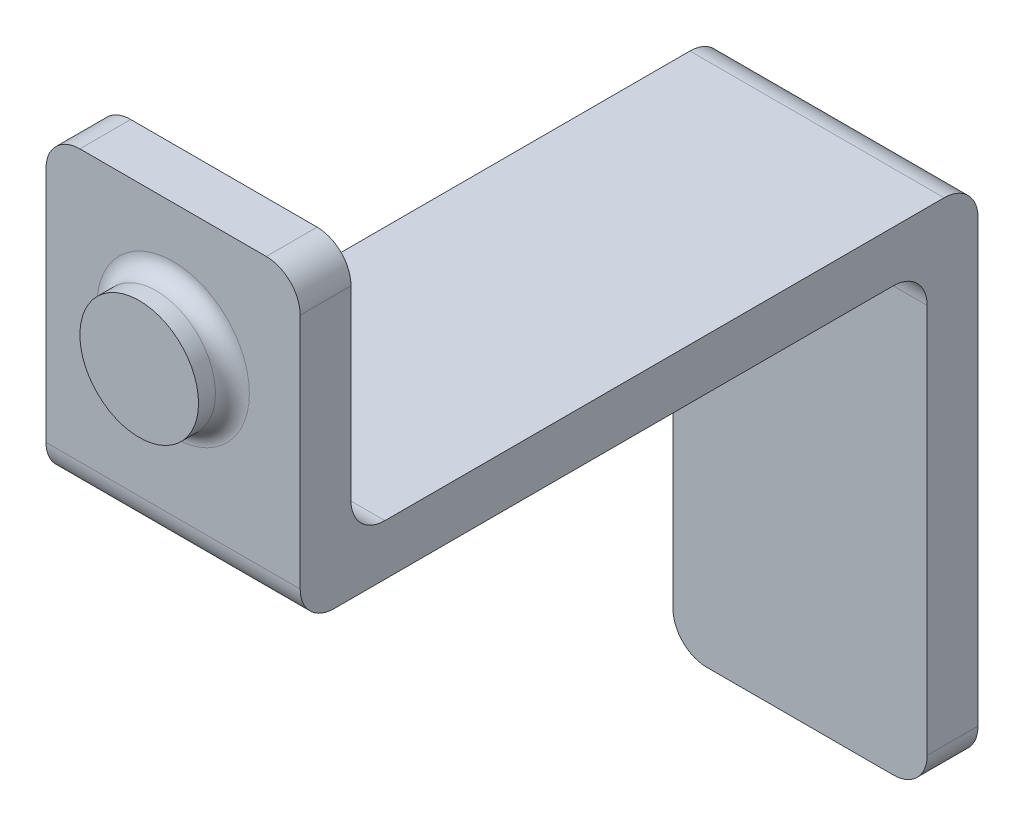
ISO-10303-21;
HEADER;
FILE_DESCRIPTION(('STEP AP214'),'2;1');
FILE_NAME('part.step','',(''),(''),'','','');
FILE_SCHEMA(('AUTOMOTIVE_DESIGN { 1 0 10303 214 1 1 1 1 }'));
ENDSEC;
DATA;
#1=APPLICATION_CONTEXT('core data for automotive mechanical design processes');
#2=APPLICATION_PROTOCOL_DEFINITION('international standard','automotive_design',2000,#1);
#3=PRODUCT_CONTEXT('',#1,'mechanical');
#4=PRODUCT('Part','Part','',(#3));
#5=PRODUCT_RELATED_PRODUCT_CATEGORY('part','',(#4));
#6=PRODUCT_DEFINITION_FORMATION('','',#4);
#7=PRODUCT_DEFINITION_CONTEXT('part definition',#1,'design');
#8=PRODUCT_DEFINITION('design','',#6,#7);
#9=PRODUCT_DEFINITION_SHAPE('','',#8);
#10=(LENGTH_UNIT() NAMED_UNIT(*) SI_UNIT(.MILLI.,.METRE.));
#11=(NAMED_UNIT(*) PLANE_ANGLE_UNIT() SI_UNIT($,.RADIAN.));
#12=(NAMED_UNIT(*) SI_UNIT($,.STERADIAN.) SOLID_ANGLE_UNIT());
#13=UNCERTAINTY_MEASURE_WITH_UNIT(LENGTH_MEASURE(1.E-05),#10,'distance_accuracy_value','');
#14=(GEOMETRIC_REPRESENTATION_CONTEXT(3) GLOBAL_UNCERTAINTY_ASSIGNED_CONTEXT((#13)) GLOBAL_UNIT_ASSIGNED_CONTEXT((#10,
#11,#12)) REPRESENTATION_CONTEXT('',''));
#15=CARTESIAN_POINT('',(0.,0.,0.));
#16=DIRECTION('',(0.,0.,1.));
#17=DIRECTION('',(1.,0.,0.));
#18=AXIS2_PLACEMENT_3D('',#15,#16,#17);
#19=CARTESIAN_POINT('',(-7.5,18.,37.));
#20=DIRECTION('',(0.,1.,0.));
#21=DIRECTION('',(0.,0.,1.));
#22=AXIS2_PLACEMENT_3D('',#19,#20,#21);
#23=PLANE('',#22);
#24=DIRECTION('',(1.,0.,0.));
#25=VECTOR('',#24,1.);
#26=CARTESIAN_POINT('',(-7.5,18.,34.));
#27=LINE('',#26,#25);
#28=CARTESIAN_POINT('',(-5.5,18.,34.));
#29=VERTEX_POINT('',#28);
#30=CARTESIAN_POINT('',(5.5,18.,34.));
#31=VERTEX_POINT('',#30);
#32=EDGE_CURVE('E191',#29,#31,#27,.T.);
#33=ORIENTED_EDGE('',*,*,#32,.F.);
#34=DIRECTION('',(0.,0.,1.));
#35=VECTOR('',#34,1.);
#36=CARTESIAN_POINT('',(-5.5,18.,37.));
#37=LINE('',#36,#35);
#38=CARTESIAN_POINT('',(-5.5,18.,37.));
#39=VERTEX_POINT('',#38);
#40=EDGE_CURVE('E245',#29,#39,#37,.T.);
#41=ORIENTED_EDGE('',*,*,#40,.T.);
#42=DIRECTION('',(1.,0.,0.));
#43=VECTOR('',#42,1.);
#44=CARTESIAN_POINT('',(-7.5,18.,37.));
#45=LINE('',#44,#43);
#46=CARTESIAN_POINT('',(5.5,18.,37.));
#47=VERTEX_POINT('',#46);
#48=EDGE_CURVE('E196',#39,#47,#45,.T.);
#49=ORIENTED_EDGE('',*,*,#48,.T.);
#50=DIRECTION('',(0.,0.,1.));
#51=VECTOR('',#50,1.);
#52=CARTESIAN_POINT('',(5.5,18.,34.));
#53=LINE('',#52,#51);
#54=EDGE_CURVE('E62',#47,#31,#53,.F.);
#55=ORIENTED_EDGE('',*,*,#54,.T.);
#56=EDGE_LOOP('',(#33,#41,#49,#55));
#57=FACE_BOUND('',#56,.T.);
#58=ADVANCED_FACE('F46',(#57),#23,.T.);
#59=CARTESIAN_POINT('',(-7.5,18.,34.));
#60=DIRECTION('',(0.,0.,-1.));
#61=DIRECTION('',(0.,1.,0.));
#62=AXIS2_PLACEMENT_3D('',#59,#60,#61);
#63=PLANE('',#62);
#64=CARTESIAN_POINT('',(0.,10.5,34.));
#65=DIRECTION('',(0.,0.,-1.));
#66=DIRECTION('',(0.,1.,0.));
#67=AXIS2_PLACEMENT_3D('',#64,#65,#66);
#68=CIRCLE('',#67,2.02500000000001);
#69=CARTESIAN_POINT('',(0.,12.525,34.));
#70=VERTEX_POINT('',#69);
#71=EDGE_CURVE('E431',#70,#70,#68,.T.);
#72=ORIENTED_EDGE('',*,*,#71,.F.);
#73=EDGE_LOOP('',(#72));
#74=FACE_BOUND('',#73,.T.);
#75=DIRECTION('',(0.,1.,0.));
#76=VECTOR('',#75,1.);
#77=CARTESIAN_POINT('',(-7.5,18.,34.));
#78=LINE('',#77,#76);
#79=CARTESIAN_POINT('',(-7.5,5.,34.));
#80=VERTEX_POINT('',#79);
#81=CARTESIAN_POINT('',(-7.5,16.,34.));
#82=VERTEX_POINT('',#81);
#83=EDGE_CURVE('E202',#80,#82,#78,.T.);
#84=ORIENTED_EDGE('',*,*,#83,.T.);
#85=CARTESIAN_POINT('',(-5.5,16.,34.));
#86=DIRECTION('',(0.,0.,-1.));
#87=DIRECTION('',(0.,1.,0.));
#88=AXIS2_PLACEMENT_3D('',#85,#86,#87);
#89=CIRCLE('',#88,2.);
#90=EDGE_CURVE('E69',#82,#29,#89,.T.);
#91=ORIENTED_EDGE('',*,*,#90,.T.);
#92=ORIENTED_EDGE('',*,*,#32,.T.);
#93=CARTESIAN_POINT('',(5.5,16.,34.));
#94=DIRECTION('',(0.,0.,-1.));
#95=DIRECTION('',(0.,1.,0.));
#96=AXIS2_PLACEMENT_3D('',#93,#94,#95);
#97=CIRCLE('',#96,2.);
#98=CARTESIAN_POINT('',(7.5,16.,34.));
#99=VERTEX_POINT('',#98);
#100=EDGE_CURVE('E262',#31,#99,#97,.T.);
#101=ORIENTED_EDGE('',*,*,#100,.T.);
#102=DIRECTION('',(0.,1.,0.));
#103=VECTOR('',#102,1.);
#104=CARTESIAN_POINT('',(7.5,18.,34.));
#105=LINE('',#104,#103);
#106=CARTESIAN_POINT('',(7.5,5.,34.));
#107=VERTEX_POINT('',#106);
#108=EDGE_CURVE('E381',#107,#99,#105,.T.);
#109=ORIENTED_EDGE('',*,*,#108,.F.);
#110=DIRECTION('',(1.,0.,0.));
#111=VECTOR('',#110,1.);
#112=CARTESIAN_POINT('',(-7.5,5.,34.));
#113=LINE('',#112,#111);
#114=EDGE_CURVE('E259',#107,#80,#113,.F.);
#115=ORIENTED_EDGE('',*,*,#114,.T.);
#116=EDGE_LOOP('',(#84,#91,#92,#101,#109,#115));
#117=FACE_BOUND('',#116,.T.);
#118=ADVANCED_FACE('F310',(#74,#117),#63,.T.);
#119=CARTESIAN_POINT('',(-7.5,3.,34.));
#120=DIRECTION('',(0.,1.,0.));
#121=DIRECTION('',(0.,0.,1.));
#122=AXIS2_PLACEMENT_3D('',#119,#120,#121);
#123=PLANE('',#122);
#124=DIRECTION('',(0.,0.,1.));
#125=VECTOR('',#124,1.);
#126=CARTESIAN_POINT('',(7.5,3.,34.));
#127=LINE('',#126,#125);
#128=CARTESIAN_POINT('',(7.5,3.,-1.00000000000001));
#129=VERTEX_POINT('',#128);
#130=CARTESIAN_POINT('',(7.5,3.,32.));
#131=VERTEX_POINT('',#130);
#132=EDGE_CURVE('E410',#129,#131,#127,.T.);
#133=ORIENTED_EDGE('',*,*,#132,.F.);
#134=DIRECTION('',(1.,0.,0.));
#135=VECTOR('',#134,1.);
#136=CARTESIAN_POINT('',(-7.5,3.,-1.00000000000001));
#137=LINE('',#136,#135);
#138=CARTESIAN_POINT('',(-7.5,3.,-1.00000000000001));
#139=VERTEX_POINT('',#138);
#140=EDGE_CURVE('E271',#129,#139,#137,.F.);
#141=ORIENTED_EDGE('',*,*,#140,.T.);
#142=DIRECTION('',(0.,0.,1.));
#143=VECTOR('',#142,1.);
#144=CARTESIAN_POINT('',(-7.5,3.,34.));
#145=LINE('',#144,#143);
#146=CARTESIAN_POINT('',(-7.5,3.,32.));
#147=VERTEX_POINT('',#146);
#148=EDGE_CURVE('E387',#139,#147,#145,.T.);
#149=ORIENTED_EDGE('',*,*,#148,.T.);
#150=DIRECTION('',(1.,0.,0.));
#151=VECTOR('',#150,1.);
#152=CARTESIAN_POINT('',(7.5,3.,32.));
#153=LINE('',#152,#151);
#154=EDGE_CURVE('E267',#147,#131,#153,.T.);
#155=ORIENTED_EDGE('',*,*,#154,.T.);
#156=EDGE_LOOP('',(#133,#141,#149,#155));
#157=FACE_BOUND('',#156,.T.);
#158=ADVANCED_FACE('F315',(#157),#123,.T.);
#159=CARTESIAN_POINT('',(-7.5,3.,-3.00000000000001));
#160=DIRECTION('',(0.,0.,-1.));
#161=DIRECTION('',(0.,1.,0.));
#162=AXIS2_PLACEMENT_3D('',#159,#160,#161);
#163=PLANE('',#162);
#164=DIRECTION('',(1.,0.,0.));
#165=VECTOR('',#164,1.);
#166=CARTESIAN_POINT('',(-7.5,-27.,-3.00000000000002));
#167=LINE('',#166,#165);
#168=CARTESIAN_POINT('',(-5.5,-27.,-3.00000000000002));
#169=VERTEX_POINT('',#168);
#170=CARTESIAN_POINT('',(5.5,-27.,-3.00000000000002));
#171=VERTEX_POINT('',#170);
#172=EDGE_CURVE('E180',#169,#171,#167,.T.);
#173=ORIENTED_EDGE('',*,*,#172,.F.);
#174=CARTESIAN_POINT('',(-5.5,-25.,-3.00000000000002));
#175=DIRECTION('',(0.,0.,-1.));
#176=DIRECTION('',(0.,1.,0.));
#177=AXIS2_PLACEMENT_3D('',#174,#175,#176);
#178=CIRCLE('',#177,2.);
#179=CARTESIAN_POINT('',(-7.5,-25.,-3.00000000000002));
#180=VERTEX_POINT('',#179);
#181=EDGE_CURVE('E162',#169,#180,#178,.T.);
#182=ORIENTED_EDGE('',*,*,#181,.T.);
#183=DIRECTION('',(0.,1.,0.));
#184=VECTOR('',#183,1.);
#185=CARTESIAN_POINT('',(-7.5,3.,-3.00000000000001));
#186=LINE('',#185,#184);
#187=CARTESIAN_POINT('',(-7.5,1.,-3.00000000000001));
#188=VERTEX_POINT('',#187);
#189=EDGE_CURVE('E378',#180,#188,#186,.T.);
#190=ORIENTED_EDGE('',*,*,#189,.T.);
#191=DIRECTION('',(1.,0.,0.));
#192=VECTOR('',#191,1.);
#193=CARTESIAN_POINT('',(-7.5,1.,-3.00000000000001));
#194=LINE('',#193,#192);
#195=CARTESIAN_POINT('',(7.5,1.,-3.00000000000001));
#196=VERTEX_POINT('',#195);
#197=EDGE_CURVE('E185',#188,#196,#194,.T.);
#198=ORIENTED_EDGE('',*,*,#197,.T.);
#199=DIRECTION('',(0.,1.,0.));
#200=VECTOR('',#199,1.);
#201=CARTESIAN_POINT('',(7.5,3.,-3.00000000000001));
#202=LINE('',#201,#200);
#203=CARTESIAN_POINT('',(7.5,-25.,-3.00000000000002));
#204=VERTEX_POINT('',#203);
#205=EDGE_CURVE('E412',#204,#196,#202,.T.);
#206=ORIENTED_EDGE('',*,*,#205,.F.);
#207=CARTESIAN_POINT('',(5.5,-25.,-3.00000000000002));
#208=DIRECTION('',(0.,0.,-1.));
#209=DIRECTION('',(0.,1.,0.));
#210=AXIS2_PLACEMENT_3D('',#207,#208,#209);
#211=CIRCLE('',#210,2.);
#212=EDGE_CURVE('E174',#204,#171,#211,.T.);
#213=ORIENTED_EDGE('',*,*,#212,.T.);
#214=EDGE_LOOP('',(#173,#182,#190,#198,#206,#213));
#215=FACE_BOUND('',#214,.T.);
#216=ADVANCED_FACE('F188',(#215),#163,.T.);
#217=CARTESIAN_POINT('',(-7.5,-27.,-3.00000000000002));
#218=DIRECTION('',(0.,-1.,0.));
#219=DIRECTION('',(0.,0.,-1.));
#220=AXIS2_PLACEMENT_3D('',#217,#218,#219);
#221=PLANE('',#220);
#222=DIRECTION('',(1.,0.,0.));
#223=VECTOR('',#222,1.);
#224=CARTESIAN_POINT('',(-7.5,-27.,0.));
#225=LINE('',#224,#223);
#226=CARTESIAN_POINT('',(-5.5,-27.,0.));
#227=VERTEX_POINT('',#226);
#228=CARTESIAN_POINT('',(5.5,-27.,0.));
#229=VERTEX_POINT('',#228);
#230=EDGE_CURVE('E183',#227,#229,#225,.T.);
#231=ORIENTED_EDGE('',*,*,#230,.F.);
#232=DIRECTION('',(0.,0.,-1.));
#233=VECTOR('',#232,1.);
#234=CARTESIAN_POINT('',(-5.5,-27.,-3.00000000000002));
#235=LINE('',#234,#233);
#236=EDGE_CURVE('E166',#227,#169,#235,.T.);
#237=ORIENTED_EDGE('',*,*,#236,.T.);
#238=ORIENTED_EDGE('',*,*,#172,.T.);
#239=DIRECTION('',(0.,0.,-1.));
#240=VECTOR('',#239,1.);
#241=CARTESIAN_POINT('',(5.5,-27.,0.));
#242=LINE('',#241,#240);
#243=EDGE_CURVE('E186',#171,#229,#242,.F.);
#244=ORIENTED_EDGE('',*,*,#243,.T.);
#245=EDGE_LOOP('',(#231,#237,#238,#244));
#246=FACE_BOUND('',#245,.T.);
#247=ADVANCED_FACE('F179',(#246),#221,.T.);
#248=CARTESIAN_POINT('',(-7.5,-27.,0.));
#249=DIRECTION('',(0.,0.,1.));
#250=DIRECTION('',(0.,-1.,0.));
#251=AXIS2_PLACEMENT_3D('',#248,#249,#250);
#252=PLANE('',#251);
#253=DIRECTION('',(0.,-1.,0.));
#254=VECTOR('',#253,1.);
#255=CARTESIAN_POINT('',(-7.5,-27.,0.));
#256=LINE('',#255,#254);
#257=CARTESIAN_POINT('',(-7.5,-2.,0.));
#258=VERTEX_POINT('',#257);
#259=CARTESIAN_POINT('',(-7.5,-25.,0.));
#260=VERTEX_POINT('',#259);
#261=EDGE_CURVE('E367',#258,#260,#256,.T.);
#262=ORIENTED_EDGE('',*,*,#261,.T.);
#263=CARTESIAN_POINT('',(-5.5,-25.,0.));
#264=DIRECTION('',(0.,0.,1.));
#265=DIRECTION('',(0.,-1.,0.));
#266=AXIS2_PLACEMENT_3D('',#263,#264,#265);
#267=CIRCLE('',#266,2.);
#268=EDGE_CURVE('E226',#260,#227,#267,.T.);
#269=ORIENTED_EDGE('',*,*,#268,.T.);
#270=ORIENTED_EDGE('',*,*,#230,.T.);
#271=CARTESIAN_POINT('',(5.5,-25.,0.));
#272=DIRECTION('',(0.,0.,1.));
#273=DIRECTION('',(0.,-1.,0.));
#274=AXIS2_PLACEMENT_3D('',#271,#272,#273);
#275=CIRCLE('',#274,2.);
#276=CARTESIAN_POINT('',(7.5,-25.,0.));
#277=VERTEX_POINT('',#276);
#278=EDGE_CURVE('E223',#229,#277,#275,.T.);
#279=ORIENTED_EDGE('',*,*,#278,.T.);
#280=DIRECTION('',(0.,-1.,0.));
#281=VECTOR('',#280,1.);
#282=CARTESIAN_POINT('',(7.5,-27.,0.));
#283=LINE('',#282,#281);
#284=CARTESIAN_POINT('',(7.5,-2.,0.));
#285=VERTEX_POINT('',#284);
#286=EDGE_CURVE('E418',#285,#277,#283,.T.);
#287=ORIENTED_EDGE('',*,*,#286,.F.);
#288=DIRECTION('',(1.,0.,0.));
#289=VECTOR('',#288,1.);
#290=CARTESIAN_POINT('',(-7.5,-2.,0.));
#291=LINE('',#290,#289);
#292=EDGE_CURVE('E220',#285,#258,#291,.F.);
#293=ORIENTED_EDGE('',*,*,#292,.T.);
#294=EDGE_LOOP('',(#262,#269,#270,#279,#287,#293));
#295=FACE_BOUND('',#294,.T.);
#296=ADVANCED_FACE('F460',(#295),#252,.T.);
#297=CARTESIAN_POINT('',(-7.5,0.,0.));
#298=DIRECTION('',(0.,-1.,0.));
#299=DIRECTION('',(0.,0.,-1.));
#300=AXIS2_PLACEMENT_3D('',#297,#298,#299);
#301=PLANE('',#300);
#302=DIRECTION('',(0.,0.,-1.));
#303=VECTOR('',#302,1.);
#304=CARTESIAN_POINT('',(7.5,0.,0.));
#305=LINE('',#304,#303);
#306=CARTESIAN_POINT('',(7.5,0.,35.));
#307=VERTEX_POINT('',#306);
#308=CARTESIAN_POINT('',(7.5,0.,2.));
#309=VERTEX_POINT('',#308);
#310=EDGE_CURVE('E421',#307,#309,#305,.T.);
#311=ORIENTED_EDGE('',*,*,#310,.F.);
#312=DIRECTION('',(1.,0.,0.));
#313=VECTOR('',#312,1.);
#314=CARTESIAN_POINT('',(-7.5,0.,35.));
#315=LINE('',#314,#313);
#316=CARTESIAN_POINT('',(-7.5,0.,35.));
#317=VERTEX_POINT('',#316);
#318=EDGE_CURVE('E278',#307,#317,#315,.F.);
#319=ORIENTED_EDGE('',*,*,#318,.T.);
#320=DIRECTION('',(0.,0.,-1.));
#321=VECTOR('',#320,1.);
#322=CARTESIAN_POINT('',(-7.5,0.,0.));
#323=LINE('',#322,#321);
#324=CARTESIAN_POINT('',(-7.5,0.,2.));
#325=VERTEX_POINT('',#324);
#326=EDGE_CURVE('E364',#317,#325,#323,.T.);
#327=ORIENTED_EDGE('',*,*,#326,.T.);
#328=DIRECTION('',(1.,0.,0.));
#329=VECTOR('',#328,1.);
#330=CARTESIAN_POINT('',(7.5,0.,2.));
#331=LINE('',#330,#329);
#332=EDGE_CURVE('E274',#325,#309,#331,.T.);
#333=ORIENTED_EDGE('',*,*,#332,.T.);
#334=EDGE_LOOP('',(#311,#319,#327,#333));
#335=FACE_BOUND('',#334,.T.);
#336=ADVANCED_FACE('F370',(#335),#301,.T.);
#337=CARTESIAN_POINT('',(-7.5,0.,37.));
#338=DIRECTION('',(0.,0.,1.));
#339=DIRECTION('',(1.,0.,0.));
#340=AXIS2_PLACEMENT_3D('',#337,#338,#339);
#341=PLANE('',#340);
#342=CARTESIAN_POINT('',(0.,10.5,37.));
#343=DIRECTION('',(0.,0.,1.));
#344=DIRECTION('',(1.,0.,0.));
#345=AXIS2_PLACEMENT_3D('',#342,#343,#344);
#346=CIRCLE('',#345,4.5);
#347=CARTESIAN_POINT('',(4.5,10.5,37.));
#348=VERTEX_POINT('',#347);
#349=EDGE_CURVE('E11',#348,#348,#346,.F.);
#350=ORIENTED_EDGE('',*,*,#349,.T.);
#351=EDGE_LOOP('',(#350));
#352=FACE_BOUND('',#351,.T.);
#353=ORIENTED_EDGE('',*,*,#48,.F.);
#354=CARTESIAN_POINT('',(-5.5,16.,37.));
#355=DIRECTION('',(0.,0.,1.));
#356=DIRECTION('',(1.,0.,0.));
#357=AXIS2_PLACEMENT_3D('',#354,#355,#356);
#358=CIRCLE('',#357,2.);
#359=CARTESIAN_POINT('',(-7.5,16.,37.));
#360=VERTEX_POINT('',#359);
#361=EDGE_CURVE('E256',#39,#360,#358,.T.);
#362=ORIENTED_EDGE('',*,*,#361,.T.);
#363=DIRECTION('',(0.,-1.,0.));
#364=VECTOR('',#363,1.);
#365=CARTESIAN_POINT('',(-7.5,0.,37.));
#366=LINE('',#365,#364);
#367=CARTESIAN_POINT('',(-7.5,2.,37.));
#368=VERTEX_POINT('',#367);
#369=EDGE_CURVE('E374',#360,#368,#366,.T.);
#370=ORIENTED_EDGE('',*,*,#369,.T.);
#371=DIRECTION('',(1.,0.,0.));
#372=VECTOR('',#371,1.);
#373=CARTESIAN_POINT('',(-7.5,2.,37.));
#374=LINE('',#373,#372);
#375=CARTESIAN_POINT('',(7.5,2.,37.));
#376=VERTEX_POINT('',#375);
#377=EDGE_CURVE('E249',#368,#376,#374,.T.);
#378=ORIENTED_EDGE('',*,*,#377,.T.);
#379=DIRECTION('',(0.,-1.,0.));
#380=VECTOR('',#379,1.);
#381=CARTESIAN_POINT('',(7.5,0.,37.));
#382=LINE('',#381,#380);
#383=CARTESIAN_POINT('',(7.5,16.,37.));
#384=VERTEX_POINT('',#383);
#385=EDGE_CURVE('E402',#384,#376,#382,.T.);
#386=ORIENTED_EDGE('',*,*,#385,.F.);
#387=CARTESIAN_POINT('',(5.5,16.,37.));
#388=DIRECTION('',(0.,0.,1.));
#389=DIRECTION('',(1.,0.,0.));
#390=AXIS2_PLACEMENT_3D('',#387,#388,#389);
#391=CIRCLE('',#390,2.);
#392=EDGE_CURVE('E253',#384,#47,#391,.T.);
#393=ORIENTED_EDGE('',*,*,#392,.T.);
#394=EDGE_LOOP('',(#353,#362,#370,#378,#386,#393));
#395=FACE_BOUND('',#394,.T.);
#396=ADVANCED_FACE('F320',(#352,#395),#341,.T.);
#397=CARTESIAN_POINT('',(-7.5,0.,0.));
#398=DIRECTION('',(-1.,0.,0.));
#399=DIRECTION('',(0.,0.,1.));
#400=AXIS2_PLACEMENT_3D('',#397,#398,#399);
#401=PLANE('',#400);
#402=ORIENTED_EDGE('',*,*,#189,.F.);
#403=DIRECTION('',(0.,0.,-1.));
#404=VECTOR('',#403,1.);
#405=CARTESIAN_POINT('',(-7.5,-25.,0.));
#406=LINE('',#405,#404);
#407=EDGE_CURVE('E167',#180,#260,#406,.F.);
#408=ORIENTED_EDGE('',*,*,#407,.T.);
#409=ORIENTED_EDGE('',*,*,#261,.F.);
#410=CARTESIAN_POINT('',(-7.5,-2.,2.));
#411=DIRECTION('',(-1.,0.,0.));
#412=DIRECTION('',(0.,0.,1.));
#413=AXIS2_PLACEMENT_3D('',#410,#411,#412);
#414=CIRCLE('',#413,2.);
#415=EDGE_CURVE('E290',#258,#325,#414,.F.);
#416=ORIENTED_EDGE('',*,*,#415,.T.);
#417=ORIENTED_EDGE('',*,*,#326,.F.);
#418=CARTESIAN_POINT('',(-7.5,2.,35.));
#419=DIRECTION('',(-1.,0.,0.));
#420=DIRECTION('',(0.,0.,1.));
#421=AXIS2_PLACEMENT_3D('',#418,#419,#420);
#422=CIRCLE('',#421,2.);
#423=EDGE_CURVE('E173',#317,#368,#422,.T.);
#424=ORIENTED_EDGE('',*,*,#423,.T.);
#425=ORIENTED_EDGE('',*,*,#369,.F.);
#426=DIRECTION('',(0.,0.,1.));
#427=VECTOR('',#426,1.);
#428=CARTESIAN_POINT('',(-7.5,16.,0.));
#429=LINE('',#428,#427);
#430=EDGE_CURVE('E215',#360,#82,#429,.F.);
#431=ORIENTED_EDGE('',*,*,#430,.T.);
#432=ORIENTED_EDGE('',*,*,#83,.F.);
#433=CARTESIAN_POINT('',(-7.5,5.,32.));
#434=DIRECTION('',(-1.,0.,0.));
#435=DIRECTION('',(0.,0.,1.));
#436=AXIS2_PLACEMENT_3D('',#433,#434,#435);
#437=CIRCLE('',#436,2.);
#438=EDGE_CURVE('E284',#80,#147,#437,.F.);
#439=ORIENTED_EDGE('',*,*,#438,.T.);
#440=ORIENTED_EDGE('',*,*,#148,.F.);
#441=CARTESIAN_POINT('',(-7.5,1.,-1.00000000000001));
#442=DIRECTION('',(-1.,0.,0.));
#443=DIRECTION('',(0.,0.,1.));
#444=AXIS2_PLACEMENT_3D('',#441,#442,#443);
#445=CIRCLE('',#444,2.);
#446=EDGE_CURVE('E212',#139,#188,#445,.T.);
#447=ORIENTED_EDGE('',*,*,#446,.T.);
#448=EDGE_LOOP('',(#402,#408,#409,#416,#417,#424,#425,#431,#432,#439,#440,#447));
#449=FACE_BOUND('',#448,.T.);
#450=ADVANCED_FACE('F363',(#449),#401,.T.);
#451=CARTESIAN_POINT('',(7.5,0.,0.));
#452=DIRECTION('',(-1.,0.,0.));
#453=DIRECTION('',(0.,0.,1.));
#454=AXIS2_PLACEMENT_3D('',#451,#452,#453);
#455=PLANE('',#454);
#456=ORIENTED_EDGE('',*,*,#286,.T.);
#457=DIRECTION('',(0.,0.,-1.));
#458=VECTOR('',#457,1.);
#459=CARTESIAN_POINT('',(7.5,-25.,-3.00000000000002));
#460=LINE('',#459,#458);
#461=EDGE_CURVE('E239',#277,#204,#460,.T.);
#462=ORIENTED_EDGE('',*,*,#461,.T.);
#463=ORIENTED_EDGE('',*,*,#205,.T.);
#464=CARTESIAN_POINT('',(7.5,1.,-1.00000000000001));
#465=DIRECTION('',(-1.,0.,0.));
#466=DIRECTION('',(0.,0.,1.));
#467=AXIS2_PLACEMENT_3D('',#464,#465,#466);
#468=CIRCLE('',#467,2.);
#469=EDGE_CURVE('E232',#196,#129,#468,.F.);
#470=ORIENTED_EDGE('',*,*,#469,.T.);
#471=ORIENTED_EDGE('',*,*,#132,.T.);
#472=CARTESIAN_POINT('',(7.5,5.,32.));
#473=DIRECTION('',(-1.,0.,0.));
#474=DIRECTION('',(0.,0.,1.));
#475=AXIS2_PLACEMENT_3D('',#472,#473,#474);
#476=CIRCLE('',#475,2.);
#477=EDGE_CURVE('E281',#131,#107,#476,.T.);
#478=ORIENTED_EDGE('',*,*,#477,.T.);
#479=ORIENTED_EDGE('',*,*,#108,.T.);
#480=DIRECTION('',(0.,0.,1.));
#481=VECTOR('',#480,1.);
#482=CARTESIAN_POINT('',(7.5,16.,37.));
#483=LINE('',#482,#481);
#484=EDGE_CURVE('E235',#99,#384,#483,.T.);
#485=ORIENTED_EDGE('',*,*,#484,.T.);
#486=ORIENTED_EDGE('',*,*,#385,.T.);
#487=CARTESIAN_POINT('',(7.5,2.,35.));
#488=DIRECTION('',(-1.,0.,0.));
#489=DIRECTION('',(0.,0.,1.));
#490=AXIS2_PLACEMENT_3D('',#487,#488,#489);
#491=CIRCLE('',#490,2.);
#492=EDGE_CURVE('E229',#376,#307,#491,.F.);
#493=ORIENTED_EDGE('',*,*,#492,.T.);
#494=ORIENTED_EDGE('',*,*,#310,.T.);
#495=CARTESIAN_POINT('',(7.5,-2.,2.));
#496=DIRECTION('',(-1.,0.,0.));
#497=DIRECTION('',(0.,0.,1.));
#498=AXIS2_PLACEMENT_3D('',#495,#496,#497);
#499=CIRCLE('',#498,2.);
#500=EDGE_CURVE('E287',#309,#285,#499,.T.);
#501=ORIENTED_EDGE('',*,*,#500,.T.);
#502=EDGE_LOOP('',(#456,#462,#463,#470,#471,#478,#479,#485,#486,#493,#494,#501));
#503=FACE_BOUND('',#502,.T.);
#504=ADVANCED_FACE('F325',(#503),#455,.F.);
#505=CARTESIAN_POINT('',(-5.5,-25.,-3.00000000000002));
#506=DIRECTION('',(0.,0.,-1.));
#507=DIRECTION('',(-1.,0.,0.));
#508=AXIS2_PLACEMENT_3D('',#505,#506,#507);
#509=CYLINDRICAL_SURFACE('',#508,2.);
#510=ORIENTED_EDGE('',*,*,#268,.F.);
#511=ORIENTED_EDGE('',*,*,#407,.F.);
#512=ORIENTED_EDGE('',*,*,#181,.F.);
#513=ORIENTED_EDGE('',*,*,#236,.F.);
#514=EDGE_LOOP('',(#510,#511,#512,#513));
#515=FACE_BOUND('',#514,.T.);
#516=ADVANCED_FACE('F165',(#515),#509,.T.);
#517=CARTESIAN_POINT('',(5.5,-25.,0.));
#518=DIRECTION('',(0.,0.,1.));
#519=DIRECTION('',(1.,0.,0.));
#520=AXIS2_PLACEMENT_3D('',#517,#518,#519);
#521=CYLINDRICAL_SURFACE('',#520,2.);
#522=ORIENTED_EDGE('',*,*,#278,.F.);
#523=ORIENTED_EDGE('',*,*,#243,.F.);
#524=ORIENTED_EDGE('',*,*,#212,.F.);
#525=ORIENTED_EDGE('',*,*,#461,.F.);
#526=EDGE_LOOP('',(#522,#523,#524,#525));
#527=FACE_BOUND('',#526,.T.);
#528=ADVANCED_FACE('F324',(#527),#521,.T.);
#529=CARTESIAN_POINT('',(-5.5,16.,37.));
#530=DIRECTION('',(0.,0.,1.));
#531=DIRECTION('',(0.,-1.,0.));
#532=AXIS2_PLACEMENT_3D('',#529,#530,#531);
#533=CYLINDRICAL_SURFACE('',#532,2.);
#534=ORIENTED_EDGE('',*,*,#90,.F.);
#535=ORIENTED_EDGE('',*,*,#430,.F.);
#536=ORIENTED_EDGE('',*,*,#361,.F.);
#537=ORIENTED_EDGE('',*,*,#40,.F.);
#538=EDGE_LOOP('',(#534,#535,#536,#537));
#539=FACE_BOUND('',#538,.T.);
#540=ADVANCED_FACE('F328',(#539),#533,.T.);
#541=CARTESIAN_POINT('',(5.5,16.,0.));
#542=DIRECTION('',(0.,0.,-1.));
#543=DIRECTION('',(0.,1.,0.));
#544=AXIS2_PLACEMENT_3D('',#541,#542,#543);
#545=CYLINDRICAL_SURFACE('',#544,2.);
#546=ORIENTED_EDGE('',*,*,#100,.F.);
#547=ORIENTED_EDGE('',*,*,#54,.F.);
#548=ORIENTED_EDGE('',*,*,#392,.F.);
#549=ORIENTED_EDGE('',*,*,#484,.F.);
#550=EDGE_LOOP('',(#546,#547,#548,#549));
#551=FACE_BOUND('',#550,.T.);
#552=ADVANCED_FACE('F332',(#551),#545,.T.);
#553=CARTESIAN_POINT('',(-7.5,1.,-1.00000000000001));
#554=DIRECTION('',(1.,0.,0.));
#555=DIRECTION('',(0.,0.,-1.));
#556=AXIS2_PLACEMENT_3D('',#553,#554,#555);
#557=CYLINDRICAL_SURFACE('',#556,2.);
#558=ORIENTED_EDGE('',*,*,#446,.F.);
#559=ORIENTED_EDGE('',*,*,#140,.F.);
#560=ORIENTED_EDGE('',*,*,#469,.F.);
#561=ORIENTED_EDGE('',*,*,#197,.F.);
#562=EDGE_LOOP('',(#558,#559,#560,#561));
#563=FACE_BOUND('',#562,.T.);
#564=ADVANCED_FACE('F336',(#563),#557,.T.);
#565=CARTESIAN_POINT('',(-7.5,5.,32.));
#566=DIRECTION('',(-1.,0.,0.));
#567=DIRECTION('',(0.,0.,1.));
#568=AXIS2_PLACEMENT_3D('',#565,#566,#567);
#569=CYLINDRICAL_SURFACE('',#568,2.);
#570=ORIENTED_EDGE('',*,*,#438,.F.);
#571=ORIENTED_EDGE('',*,*,#114,.F.);
#572=ORIENTED_EDGE('',*,*,#477,.F.);
#573=ORIENTED_EDGE('',*,*,#154,.F.);
#574=EDGE_LOOP('',(#570,#571,#572,#573));
#575=FACE_BOUND('',#574,.T.);
#576=ADVANCED_FACE('F340',(#575),#569,.F.);
#577=CARTESIAN_POINT('',(-7.5,2.,35.));
#578=DIRECTION('',(1.,0.,0.));
#579=DIRECTION('',(0.,0.,-1.));
#580=AXIS2_PLACEMENT_3D('',#577,#578,#579);
#581=CYLINDRICAL_SURFACE('',#580,2.);
#582=ORIENTED_EDGE('',*,*,#423,.F.);
#583=ORIENTED_EDGE('',*,*,#318,.F.);
#584=ORIENTED_EDGE('',*,*,#492,.F.);
#585=ORIENTED_EDGE('',*,*,#377,.F.);
#586=EDGE_LOOP('',(#582,#583,#584,#585));
#587=FACE_BOUND('',#586,.T.);
#588=ADVANCED_FACE('F344',(#587),#581,.T.);
#589=CARTESIAN_POINT('',(-7.5,-2.,2.));
#590=DIRECTION('',(-1.,0.,0.));
#591=DIRECTION('',(0.,0.,1.));
#592=AXIS2_PLACEMENT_3D('',#589,#590,#591);
#593=CYLINDRICAL_SURFACE('',#592,2.);
#594=ORIENTED_EDGE('',*,*,#415,.F.);
#595=ORIENTED_EDGE('',*,*,#292,.F.);
#596=ORIENTED_EDGE('',*,*,#500,.F.);
#597=ORIENTED_EDGE('',*,*,#332,.F.);
#598=EDGE_LOOP('',(#594,#595,#596,#597));
#599=FACE_BOUND('',#598,.T.);
#600=ADVANCED_FACE('F347',(#599),#593,.F.);
#601=CARTESIAN_POINT('',(0.,10.5,39.));
#602=DIRECTION('',(0.,0.,-1.));
#603=DIRECTION('',(-1.,0.,0.));
#604=AXIS2_PLACEMENT_3D('',#601,#602,#603);
#605=CYLINDRICAL_SURFACE('',#604,3.5);
#606=CARTESIAN_POINT('',(0.,10.5,38.));
#607=DIRECTION('',(0.,0.,1.));
#608=DIRECTION('',(1.,0.,0.));
#609=AXIS2_PLACEMENT_3D('',#606,#607,#608);
#610=CIRCLE('',#609,3.5);
#611=CARTESIAN_POINT('',(3.5,10.5,38.));
#612=VERTEX_POINT('',#611);
#613=EDGE_CURVE('E55',#612,#612,#610,.T.);
#614=ORIENTED_EDGE('',*,*,#613,.T.);
#615=EDGE_LOOP('',(#614));
#616=FACE_BOUND('',#615,.T.);
#617=CARTESIAN_POINT('',(0.,10.5,39.));
#618=DIRECTION('',(0.,0.,1.));
#619=DIRECTION('',(1.,0.,0.));
#620=AXIS2_PLACEMENT_3D('',#617,#618,#619);
#621=CIRCLE('',#620,3.5);
#622=CARTESIAN_POINT('',(3.5,10.5,39.));
#623=VERTEX_POINT('',#622);
#624=EDGE_CURVE('E426',#623,#623,#621,.T.);
#625=ORIENTED_EDGE('',*,*,#624,.F.);
#626=EDGE_LOOP('',(#625));
#627=FACE_BOUND('',#626,.T.);
#628=ADVANCED_FACE('F296',(#616,#627),#605,.T.);
#629=CARTESIAN_POINT('',(0.,0.,39.));
#630=DIRECTION('',(0.,0.,1.));
#631=DIRECTION('',(1.,0.,0.));
#632=AXIS2_PLACEMENT_3D('',#629,#630,#631);
#633=PLANE('',#632);
#634=ORIENTED_EDGE('',*,*,#624,.T.);
#635=EDGE_LOOP('',(#634));
#636=FACE_BOUND('',#635,.T.);
#637=ADVANCED_FACE('F354',(#636),#633,.T.);
#638=CARTESIAN_POINT('',(0.,10.5,38.));
#639=DIRECTION('',(0.,0.,-1.));
#640=DIRECTION('',(0.,1.,0.));
#641=AXIS2_PLACEMENT_3D('',#638,#639,#640);
#642=CYLINDRICAL_SURFACE('',#641,2.02500000000001);
#643=CARTESIAN_POINT('',(0.,10.5,38.));
#644=DIRECTION('',(0.,0.,-1.));
#645=DIRECTION('',(0.,1.,0.));
#646=AXIS2_PLACEMENT_3D('',#643,#644,#645);
#647=CIRCLE('',#646,2.02500000000001);
#648=CARTESIAN_POINT('',(0.,12.525,38.));
#649=VERTEX_POINT('',#648);
#650=EDGE_CURVE('E430',#649,#649,#647,.T.);
#651=ORIENTED_EDGE('',*,*,#650,.F.);
#652=EDGE_LOOP('',(#651));
#653=FACE_BOUND('',#652,.T.);
#654=ORIENTED_EDGE('',*,*,#71,.T.);
#655=EDGE_LOOP('',(#654));
#656=FACE_BOUND('',#655,.T.);
#657=ADVANCED_FACE('F305',(#653,#656),#642,.F.);
#658=CARTESIAN_POINT('',(0.,10.5,38.));
#659=DIRECTION('',(0.,0.,-1.));
#660=DIRECTION('',(0.,1.,0.));
#661=AXIS2_PLACEMENT_3D('',#658,#659,#660);
#662=PLANE('',#661);
#663=ORIENTED_EDGE('',*,*,#650,.T.);
#664=EDGE_LOOP('',(#663));
#665=FACE_BOUND('',#664,.T.);
#666=ADVANCED_FACE('F300',(#665),#662,.T.);
#667=CARTESIAN_POINT('',(0.,10.5,38.));
#668=DIRECTION('',(0.,0.,1.));
#669=DIRECTION('',(1.,0.,0.));
#670=AXIS2_PLACEMENT_3D('',#667,#668,#669);
#671=TOROIDAL_SURFACE('',#670,4.5,1.);
#672=ORIENTED_EDGE('',*,*,#349,.F.);
#673=EDGE_LOOP('',(#672));
#674=FACE_BOUND('',#673,.T.);
#675=ORIENTED_EDGE('',*,*,#613,.F.);
#676=EDGE_LOOP('',(#675));
#677=FACE_BOUND('',#676,.T.);
#678=ADVANCED_FACE('F48',(#674,#677),#671,.F.);
#679=CLOSED_SHELL('',(#58,#118,#158,#216,#247,#296,#336,#396,#450,#504,#516,#528,#540,#552,#564,
#576,#588,#600,#628,#637,#657,#666,#678));
#680=MANIFOLD_SOLID_BREP('B2',#679);
#681=ADVANCED_BREP_SHAPE_REPRESENTATION('',(#18,#680),#14);
#682=SHAPE_DEFINITION_REPRESENTATION(#9,#681);
ENDSEC;
END-ISO-10303-21;
